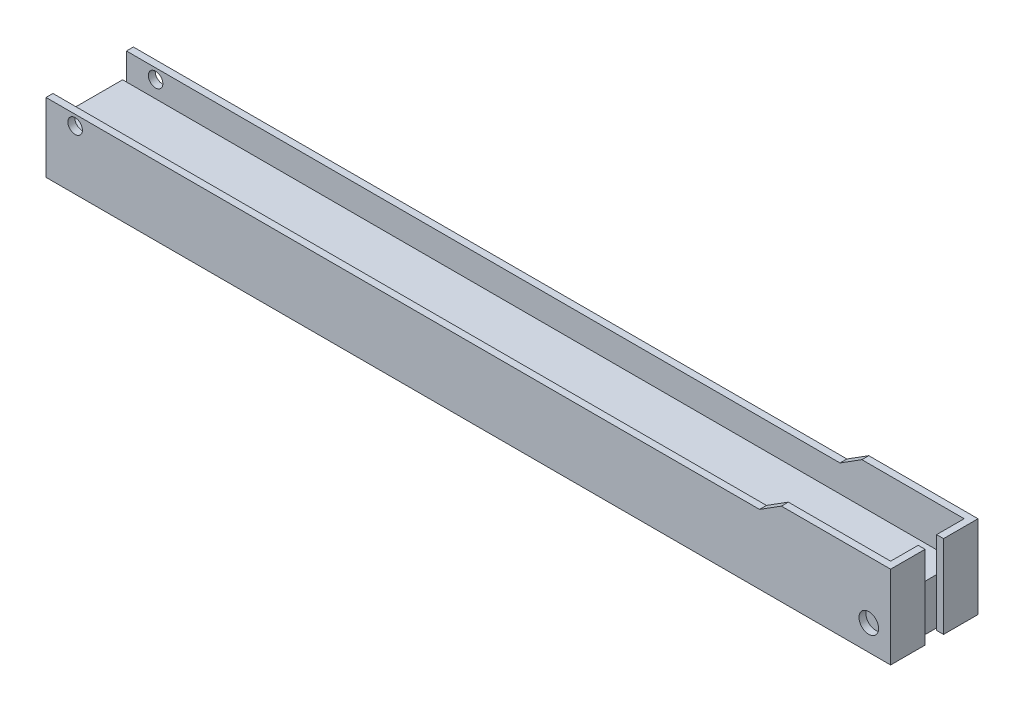
ISO-10303-21;
HEADER;
FILE_DESCRIPTION(('STEP AP214'),'2;1');
FILE_NAME('part.step','',(''),(''),'','','');
FILE_SCHEMA(('AUTOMOTIVE_DESIGN { 1 0 10303 214 1 1 1 1 }'));
ENDSEC;
DATA;
#1=APPLICATION_CONTEXT('core data for automotive mechanical design processes');
#2=APPLICATION_PROTOCOL_DEFINITION('international standard','automotive_design',2000,#1);
#3=PRODUCT_CONTEXT('',#1,'mechanical');
#4=PRODUCT('Part','Part','',(#3));
#5=PRODUCT_RELATED_PRODUCT_CATEGORY('part','',(#4));
#6=PRODUCT_DEFINITION_FORMATION('','',#4);
#7=PRODUCT_DEFINITION_CONTEXT('part definition',#1,'design');
#8=PRODUCT_DEFINITION('design','',#6,#7);
#9=PRODUCT_DEFINITION_SHAPE('','',#8);
#10=(LENGTH_UNIT() NAMED_UNIT(*) SI_UNIT(.MILLI.,.METRE.));
#11=(NAMED_UNIT(*) PLANE_ANGLE_UNIT() SI_UNIT($,.RADIAN.));
#12=(NAMED_UNIT(*) SI_UNIT($,.STERADIAN.) SOLID_ANGLE_UNIT());
#13=UNCERTAINTY_MEASURE_WITH_UNIT(LENGTH_MEASURE(1.E-05),#10,'distance_accuracy_value','');
#14=(GEOMETRIC_REPRESENTATION_CONTEXT(3) GLOBAL_UNCERTAINTY_ASSIGNED_CONTEXT((#13)) GLOBAL_UNIT_ASSIGNED_CONTEXT((#10,
#11,#12)) REPRESENTATION_CONTEXT('',''));
#15=CARTESIAN_POINT('',(0.,0.,0.));
#16=DIRECTION('',(0.,0.,1.));
#17=DIRECTION('',(1.,0.,0.));
#18=AXIS2_PLACEMENT_3D('',#15,#16,#17);
#19=CARTESIAN_POINT('',(-73.6600000000003,14.4779999999995,-7.61999999999996));
#20=DIRECTION('',(0.,0.,1.));
#21=DIRECTION('',(0.999999999999999,0.,0.));
#22=AXIS2_PLACEMENT_3D('',#19,#20,#21);
#23=PLANE('',#22);
#24=CARTESIAN_POINT('',(69.85,4.44499999999981,-7.61999999999996));
#25=DIRECTION('',(0.,0.,1.));
#26=DIRECTION('',(0.999999999999999,0.,0.));
#27=AXIS2_PLACEMENT_3D('',#24,#25,#26);
#28=CIRCLE('',#27,1.7145);
#29=CARTESIAN_POINT('',(71.5645,4.44499999999981,-7.61999999999996));
#30=VERTEX_POINT('',#29);
#31=EDGE_CURVE('E478',#30,#30,#28,.T.);
#32=ORIENTED_EDGE('',*,*,#31,.T.);
#33=EDGE_LOOP('',(#32));
#34=FACE_BOUND('',#33,.T.);
#35=CARTESIAN_POINT('',(-68.5800000000003,10.2966462483453,-7.61999999999996));
#36=DIRECTION('',(0.,0.,1.));
#37=DIRECTION('',(0.999999999999999,0.,0.));
#38=AXIS2_PLACEMENT_3D('',#35,#36,#37);
#39=CIRCLE('',#38,1.26999999999999);
#40=CARTESIAN_POINT('',(-67.3100000000003,10.2966462483453,-7.61999999999996));
#41=VERTEX_POINT('',#40);
#42=EDGE_CURVE('E458',#41,#41,#39,.T.);
#43=ORIENTED_EDGE('',*,*,#42,.T.);
#44=EDGE_LOOP('',(#43));
#45=FACE_BOUND('',#44,.T.);
#46=DIRECTION('',(0.,-0.999999999999999,0.));
#47=VECTOR('',#46,1.);
#48=CARTESIAN_POINT('',(-73.6600000000003,14.4779999999995,-7.61999999999996));
#49=LINE('',#48,#47);
#50=CARTESIAN_POINT('',(-73.6600000000002,12.0746462483452,-7.61999999999996));
#51=VERTEX_POINT('',#50);
#52=CARTESIAN_POINT('',(-73.6600000000005,0.,-7.61999999999996));
#53=VERTEX_POINT('',#52);
#54=EDGE_CURVE('E64',#51,#53,#49,.T.);
#55=ORIENTED_EDGE('',*,*,#54,.F.);
#56=DIRECTION('',(-0.999999999999999,0.,0.));
#57=VECTOR('',#56,1.);
#58=CARTESIAN_POINT('',(0.,12.0746462483456,-7.61999999999996));
#59=LINE('',#58,#57);
#60=CARTESIAN_POINT('',(50.7999999999995,12.0746462483453,-7.61999999999996));
#61=VERTEX_POINT('',#60);
#62=EDGE_CURVE('E230',#61,#51,#59,.T.);
#63=ORIENTED_EDGE('',*,*,#62,.F.);
#64=DIRECTION('',(-0.845785644482006,-0.533522861354747,0.));
#65=VECTOR('',#64,1.);
#66=CARTESIAN_POINT('',(9.01141394936245,-14.2856569173105,-7.61999999999996));
#67=LINE('',#66,#65);
#68=CARTESIAN_POINT('',(54.6099999999992,14.4779999999999,-7.61999999999996));
#69=VERTEX_POINT('',#68);
#70=EDGE_CURVE('E235',#69,#61,#67,.T.);
#71=ORIENTED_EDGE('',*,*,#70,.F.);
#72=DIRECTION('',(-0.999999999999999,0.,0.));
#73=VECTOR('',#72,1.);
#74=CARTESIAN_POINT('',(-73.6600000000003,14.4779999999995,-7.61999999999996));
#75=LINE('',#74,#73);
#76=CARTESIAN_POINT('',(73.6599999999996,14.4780000000001,-7.61999999999996));
#77=VERTEX_POINT('',#76);
#78=EDGE_CURVE('E289',#77,#69,#75,.T.);
#79=ORIENTED_EDGE('',*,*,#78,.F.);
#80=DIRECTION('',(0.,-0.999999999999999,0.));
#81=VECTOR('',#80,1.);
#82=CARTESIAN_POINT('',(73.6599999999996,14.4780000000001,-7.61999999999996));
#83=LINE('',#82,#81);
#84=CARTESIAN_POINT('',(73.6599999999998,0.,-7.61999999999996));
#85=VERTEX_POINT('',#84);
#86=EDGE_CURVE('E13',#77,#85,#83,.T.);
#87=ORIENTED_EDGE('',*,*,#86,.T.);
#88=DIRECTION('',(-0.999999999999999,0.,0.));
#89=VECTOR('',#88,1.);
#90=CARTESIAN_POINT('',(-73.6600000000005,0.,-7.61999999999996));
#91=LINE('',#90,#89);
#92=EDGE_CURVE('E299',#85,#53,#91,.T.);
#93=ORIENTED_EDGE('',*,*,#92,.T.);
#94=EDGE_LOOP('',(#55,#63,#71,#79,#87,#93));
#95=FACE_BOUND('',#94,.T.);
#96=ADVANCED_FACE('F55',(#34,#45,#95),#23,.F.);
#97=CARTESIAN_POINT('',(72.4534999999999,2.22044604925031E-13,-6.41350000000007));
#98=DIRECTION('',(0.,0.,1.));
#99=DIRECTION('',(0.999999999999999,0.,0.));
#100=AXIS2_PLACEMENT_3D('',#97,#98,#99);
#101=PLANE('',#100);
#102=CARTESIAN_POINT('',(-68.5800000000003,10.2966462483453,-6.41350000000007));
#103=DIRECTION('',(0.,0.,1.));
#104=DIRECTION('',(0.999999999999999,0.,0.));
#105=AXIS2_PLACEMENT_3D('',#102,#103,#104);
#106=CIRCLE('',#105,1.26999999999999);
#107=CARTESIAN_POINT('',(-67.3100000000003,10.2966462483453,-6.41350000000007));
#108=VERTEX_POINT('',#107);
#109=EDGE_CURVE('E59',#108,#108,#106,.T.);
#110=ORIENTED_EDGE('',*,*,#109,.F.);
#111=EDGE_LOOP('',(#110));
#112=FACE_BOUND('',#111,.T.);
#113=CARTESIAN_POINT('',(69.85,4.44499999999981,-6.41350000000007));
#114=DIRECTION('',(0.,0.,1.));
#115=DIRECTION('',(0.999999999999999,0.,0.));
#116=AXIS2_PLACEMENT_3D('',#113,#114,#115);
#117=CIRCLE('',#116,1.7145);
#118=CARTESIAN_POINT('',(71.5645,4.44499999999981,-6.41350000000007));
#119=VERTEX_POINT('',#118);
#120=EDGE_CURVE('E476',#119,#119,#117,.T.);
#121=ORIENTED_EDGE('',*,*,#120,.F.);
#122=EDGE_LOOP('',(#121));
#123=FACE_BOUND('',#122,.T.);
#124=DIRECTION('',(-0.999999999999999,0.,0.));
#125=VECTOR('',#124,1.);
#126=CARTESIAN_POINT('',(0.,12.0746462483456,-6.41350000000007));
#127=LINE('',#126,#125);
#128=CARTESIAN_POINT('',(50.7999999999995,12.0746462483452,-6.41350000000007));
#129=VERTEX_POINT('',#128);
#130=CARTESIAN_POINT('',(-73.6600000000002,12.0746462483452,-6.41350000000007));
#131=VERTEX_POINT('',#130);
#132=EDGE_CURVE('E71',#129,#131,#127,.T.);
#133=ORIENTED_EDGE('',*,*,#132,.T.);
#134=DIRECTION('',(0.,0.999999999999999,0.));
#135=VECTOR('',#134,1.);
#136=CARTESIAN_POINT('',(-73.6600000000005,0.,-6.41350000000007));
#137=LINE('',#136,#135);
#138=CARTESIAN_POINT('',(-73.6600000000003,1.20650000000022,-6.41350000000007));
#139=VERTEX_POINT('',#138);
#140=EDGE_CURVE('E242',#139,#131,#137,.T.);
#141=ORIENTED_EDGE('',*,*,#140,.F.);
#142=DIRECTION('',(-0.999999999999999,0.,0.));
#143=VECTOR('',#142,1.);
#144=CARTESIAN_POINT('',(72.4534999999999,1.20650000000022,-6.41350000000007));
#145=LINE('',#144,#143);
#146=CARTESIAN_POINT('',(72.0724999999995,1.2065,-6.41350000000007));
#147=VERTEX_POINT('',#146);
#148=EDGE_CURVE('E262',#147,#139,#145,.T.);
#149=ORIENTED_EDGE('',*,*,#148,.F.);
#150=DIRECTION('',(0.,0.999999999999999,0.));
#151=VECTOR('',#150,1.);
#152=CARTESIAN_POINT('',(72.0725,-0.000999999999917733,-6.41350000000007));
#153=LINE('',#152,#151);
#154=CARTESIAN_POINT('',(72.0724999999995,-1.11022302462516E-13,-6.41350000000007));
#155=VERTEX_POINT('',#154);
#156=EDGE_CURVE('E425',#155,#147,#153,.T.);
#157=ORIENTED_EDGE('',*,*,#156,.F.);
#158=DIRECTION('',(0.999999999999999,0.,0.));
#159=VECTOR('',#158,1.);
#160=CARTESIAN_POINT('',(72.0724999999995,-1.11022302462516E-13,-6.41350000000007));
#161=LINE('',#160,#159);
#162=CARTESIAN_POINT('',(72.4534999999999,2.22044604925031E-13,-6.41350000000007));
#163=VERTEX_POINT('',#162);
#164=EDGE_CURVE('E415',#155,#163,#161,.T.);
#165=ORIENTED_EDGE('',*,*,#164,.T.);
#166=DIRECTION('',(0.,0.999999999999999,0.));
#167=VECTOR('',#166,1.);
#168=CARTESIAN_POINT('',(72.4534999999999,2.22044604925031E-13,-6.41350000000007));
#169=LINE('',#168,#167);
#170=CARTESIAN_POINT('',(72.4534999999999,14.4779999999995,-6.41350000000007));
#171=VERTEX_POINT('',#170);
#172=EDGE_CURVE('E285',#163,#171,#169,.T.);
#173=ORIENTED_EDGE('',*,*,#172,.T.);
#174=DIRECTION('',(-0.999999999999999,0.,0.));
#175=VECTOR('',#174,1.);
#176=CARTESIAN_POINT('',(72.4534999999999,14.4779999999995,-6.41350000000007));
#177=LINE('',#176,#175);
#178=CARTESIAN_POINT('',(54.6099999999992,14.4779999999999,-6.41350000000007));
#179=VERTEX_POINT('',#178);
#180=EDGE_CURVE('E264',#171,#179,#177,.T.);
#181=ORIENTED_EDGE('',*,*,#180,.T.);
#182=DIRECTION('',(-0.845785644482006,-0.533522861354747,0.));
#183=VECTOR('',#182,1.);
#184=CARTESIAN_POINT('',(9.01141394936245,-14.2856569173105,-6.41350000000007));
#185=LINE('',#184,#183);
#186=EDGE_CURVE('E245',#179,#129,#185,.T.);
#187=ORIENTED_EDGE('',*,*,#186,.T.);
#188=EDGE_LOOP('',(#133,#141,#149,#157,#165,#173,#181,#187));
#189=FACE_BOUND('',#188,.T.);
#190=ADVANCED_FACE('F240',(#112,#123,#189),#101,.T.);
#191=CARTESIAN_POINT('',(-4.44089209850063E-13,14.4779999999999,0.));
#192=DIRECTION('',(0.,0.999999999999999,0.));
#193=DIRECTION('',(0.,0.,1.));
#194=AXIS2_PLACEMENT_3D('',#191,#192,#193);
#195=PLANE('',#194);
#196=DIRECTION('',(0.,0.,-1.));
#197=VECTOR('',#196,1.);
#198=CARTESIAN_POINT('',(73.6599999999996,14.4780000000001,-7.61999999999996));
#199=LINE('',#198,#197);
#200=CARTESIAN_POINT('',(73.6599999999996,14.4780000000001,7.61999999999996));
#201=VERTEX_POINT('',#200);
#202=CARTESIAN_POINT('',(73.6599999999996,14.4780000000001,1.61290000000003));
#203=VERTEX_POINT('',#202);
#204=EDGE_CURVE('E286',#201,#203,#199,.T.);
#205=ORIENTED_EDGE('',*,*,#204,.T.);
#206=DIRECTION('',(0.999999999999999,0.,0.));
#207=VECTOR('',#206,1.);
#208=CARTESIAN_POINT('',(-73.6610000000004,14.478,1.61290000000003));
#209=LINE('',#208,#207);
#210=CARTESIAN_POINT('',(72.4534999999999,14.4779999999995,1.61290000000003));
#211=VERTEX_POINT('',#210);
#212=EDGE_CURVE('E338',#211,#203,#209,.T.);
#213=ORIENTED_EDGE('',*,*,#212,.F.);
#214=DIRECTION('',(0.,0.,-1.));
#215=VECTOR('',#214,1.);
#216=CARTESIAN_POINT('',(72.4534999999999,14.4779999999995,0.));
#217=LINE('',#216,#215);
#218=CARTESIAN_POINT('',(72.4534999999999,14.4779999999995,6.41350000000007));
#219=VERTEX_POINT('',#218);
#220=EDGE_CURVE('E370',#219,#211,#217,.T.);
#221=ORIENTED_EDGE('',*,*,#220,.F.);
#222=DIRECTION('',(-0.999999999999999,0.,0.));
#223=VECTOR('',#222,1.);
#224=CARTESIAN_POINT('',(72.4534999999999,14.4779999999995,6.41350000000007));
#225=LINE('',#224,#223);
#226=CARTESIAN_POINT('',(54.6099999999992,14.4779999999999,6.41350000000007));
#227=VERTEX_POINT('',#226);
#228=EDGE_CURVE('E266',#219,#227,#225,.T.);
#229=ORIENTED_EDGE('',*,*,#228,.T.);
#230=DIRECTION('',(0.,0.,1.));
#231=VECTOR('',#230,1.);
#232=CARTESIAN_POINT('',(54.6099999999992,14.4779999999999,-7.6210000000001));
#233=LINE('',#232,#231);
#234=CARTESIAN_POINT('',(54.6099999999992,14.4779999999999,7.61999999999996));
#235=VERTEX_POINT('',#234);
#236=EDGE_CURVE('E341',#227,#235,#233,.T.);
#237=ORIENTED_EDGE('',*,*,#236,.T.);
#238=DIRECTION('',(0.999999999999999,0.,0.));
#239=VECTOR('',#238,1.);
#240=CARTESIAN_POINT('',(-73.6600000000003,14.4779999999995,7.61999999999996));
#241=LINE('',#240,#239);
#242=EDGE_CURVE('E293',#235,#201,#241,.T.);
#243=ORIENTED_EDGE('',*,*,#242,.T.);
#244=EDGE_LOOP('',(#205,#213,#221,#229,#237,#243));
#245=FACE_BOUND('',#244,.T.);
#246=ADVANCED_FACE('F336',(#245),#195,.T.);
#247=CARTESIAN_POINT('',(73.6599999999996,14.4780000000001,-7.61999999999996));
#248=DIRECTION('',(-0.999999999999999,0.,0.));
#249=DIRECTION('',(0.,0.,1.));
#250=AXIS2_PLACEMENT_3D('',#247,#248,#249);
#251=PLANE('',#250);
#252=DIRECTION('',(0.,0.999999999999999,0.));
#253=VECTOR('',#252,1.);
#254=CARTESIAN_POINT('',(73.6599999999998,0.,1.61290000000003));
#255=LINE('',#254,#253);
#256=CARTESIAN_POINT('',(73.6599999999998,0.,1.61290000000003));
#257=VERTEX_POINT('',#256);
#258=EDGE_CURVE('E333',#257,#203,#255,.T.);
#259=ORIENTED_EDGE('',*,*,#258,.T.);
#260=ORIENTED_EDGE('',*,*,#204,.F.);
#261=DIRECTION('',(0.,-0.999999999999999,0.));
#262=VECTOR('',#261,1.);
#263=CARTESIAN_POINT('',(73.6599999999996,14.4780000000001,7.61999999999996));
#264=LINE('',#263,#262);
#265=CARTESIAN_POINT('',(73.6599999999998,0.,7.61999999999996));
#266=VERTEX_POINT('',#265);
#267=EDGE_CURVE('E295',#201,#266,#264,.T.);
#268=ORIENTED_EDGE('',*,*,#267,.T.);
#269=DIRECTION('',(0.,0.,-1.));
#270=VECTOR('',#269,1.);
#271=CARTESIAN_POINT('',(73.6599999999998,0.,-7.61999999999996));
#272=LINE('',#271,#270);
#273=EDGE_CURVE('E296',#266,#257,#272,.T.);
#274=ORIENTED_EDGE('',*,*,#273,.T.);
#275=EDGE_LOOP('',(#259,#260,#268,#274));
#276=FACE_BOUND('',#275,.T.);
#277=ADVANCED_FACE('F332',(#276),#251,.F.);
#278=CARTESIAN_POINT('',(72.4534999999999,2.22044604925031E-13,0.));
#279=DIRECTION('',(-0.999999999999999,0.,0.));
#280=DIRECTION('',(0.,0.,1.));
#281=AXIS2_PLACEMENT_3D('',#278,#279,#280);
#282=PLANE('',#281);
#283=ORIENTED_EDGE('',*,*,#220,.T.);
#284=DIRECTION('',(0.,0.999999999999999,0.));
#285=VECTOR('',#284,1.);
#286=CARTESIAN_POINT('',(72.4534999999999,2.22044604925031E-13,1.61290000000003));
#287=LINE('',#286,#285);
#288=CARTESIAN_POINT('',(72.4534999999999,2.22044604925031E-13,1.61290000000003));
#289=VERTEX_POINT('',#288);
#290=EDGE_CURVE('E413',#289,#211,#287,.T.);
#291=ORIENTED_EDGE('',*,*,#290,.F.);
#292=DIRECTION('',(0.,0.,1.));
#293=VECTOR('',#292,1.);
#294=CARTESIAN_POINT('',(72.4534999999999,2.22044604925031E-13,5.94708760241214));
#295=LINE('',#294,#293);
#296=CARTESIAN_POINT('',(72.4534999999999,2.22044604925031E-13,6.41350000000007));
#297=VERTEX_POINT('',#296);
#298=EDGE_CURVE('E435',#289,#297,#295,.T.);
#299=ORIENTED_EDGE('',*,*,#298,.T.);
#300=DIRECTION('',(0.,-0.999999999999999,0.));
#301=VECTOR('',#300,1.);
#302=CARTESIAN_POINT('',(72.4534999999999,2.22044604925031E-13,6.41350000000007));
#303=LINE('',#302,#301);
#304=EDGE_CURVE('E253',#219,#297,#303,.T.);
#305=ORIENTED_EDGE('',*,*,#304,.F.);
#306=EDGE_LOOP('',(#283,#291,#299,#305));
#307=FACE_BOUND('',#306,.T.);
#308=ADVANCED_FACE('F498',(#307),#282,.T.);
#309=CARTESIAN_POINT('',(-73.6600000000003,14.4779999999995,-7.61999999999996));
#310=DIRECTION('',(0.999999999999999,0.,0.));
#311=DIRECTION('',(0.,0.,-1.));
#312=AXIS2_PLACEMENT_3D('',#309,#310,#311);
#313=PLANE('',#312);
#314=ORIENTED_EDGE('',*,*,#140,.T.);
#315=DIRECTION('',(0.,0.,-1.));
#316=VECTOR('',#315,1.);
#317=CARTESIAN_POINT('',(-73.6600000000002,12.0746462483452,7.6210000000001));
#318=LINE('',#317,#316);
#319=EDGE_CURVE('E227',#131,#51,#318,.T.);
#320=ORIENTED_EDGE('',*,*,#319,.T.);
#321=ORIENTED_EDGE('',*,*,#54,.T.);
#322=DIRECTION('',(0.,0.,1.));
#323=VECTOR('',#322,1.);
#324=CARTESIAN_POINT('',(-73.6600000000005,0.,-7.61999999999996));
#325=LINE('',#324,#323);
#326=CARTESIAN_POINT('',(-73.6600000000005,0.,7.61999999999996));
#327=VERTEX_POINT('',#326);
#328=EDGE_CURVE('E302',#53,#327,#325,.T.);
#329=ORIENTED_EDGE('',*,*,#328,.T.);
#330=DIRECTION('',(0.,-0.999999999999999,0.));
#331=VECTOR('',#330,1.);
#332=CARTESIAN_POINT('',(-73.6600000000003,14.4779999999995,7.61999999999996));
#333=LINE('',#332,#331);
#334=CARTESIAN_POINT('',(-73.6600000000002,12.0746462483452,7.61999999999996));
#335=VERTEX_POINT('',#334);
#336=EDGE_CURVE('E309',#335,#327,#333,.T.);
#337=ORIENTED_EDGE('',*,*,#336,.F.);
#338=DIRECTION('',(0.,0.,1.));
#339=VECTOR('',#338,1.);
#340=CARTESIAN_POINT('',(-73.6600000000002,12.0746462483452,-7.6210000000001));
#341=LINE('',#340,#339);
#342=CARTESIAN_POINT('',(-73.6600000000002,12.0746462483452,6.41350000000007));
#343=VERTEX_POINT('',#342);
#344=EDGE_CURVE('E346',#343,#335,#341,.T.);
#345=ORIENTED_EDGE('',*,*,#344,.F.);
#346=DIRECTION('',(0.,-0.999999999999999,0.));
#347=VECTOR('',#346,1.);
#348=CARTESIAN_POINT('',(-73.6600000000005,0.,6.41350000000007));
#349=LINE('',#348,#347);
#350=CARTESIAN_POINT('',(-73.6600000000003,1.20650000000022,6.41350000000007));
#351=VERTEX_POINT('',#350);
#352=EDGE_CURVE('E251',#343,#351,#349,.T.);
#353=ORIENTED_EDGE('',*,*,#352,.T.);
#354=DIRECTION('',(0.,0.,1.));
#355=VECTOR('',#354,1.);
#356=CARTESIAN_POINT('',(-73.6600000000003,1.20650000000022,0.));
#357=LINE('',#356,#355);
#358=CARTESIAN_POINT('',(-73.6600000000003,1.20650000000022,4.67708760241203));
#359=VERTEX_POINT('',#358);
#360=EDGE_CURVE('E255',#359,#351,#357,.T.);
#361=ORIENTED_EDGE('',*,*,#360,.F.);
#362=DIRECTION('',(0.,0.999999999999999,0.));
#363=VECTOR('',#362,1.);
#364=CARTESIAN_POINT('',(-73.6600000000005,0.,4.67708760241203));
#365=LINE('',#364,#363);
#366=CARTESIAN_POINT('',(-73.6599999999998,1.71450000000017,4.67708760241203));
#367=VERTEX_POINT('',#366);
#368=EDGE_CURVE('E390',#359,#367,#365,.T.);
#369=ORIENTED_EDGE('',*,*,#368,.T.);
#370=DIRECTION('',(0.,0.,1.));
#371=VECTOR('',#370,1.);
#372=CARTESIAN_POINT('',(-73.6599999999998,1.71450000000017,0.));
#373=LINE('',#372,#371);
#374=CARTESIAN_POINT('',(-73.6599999999998,1.71450000000017,5.94708760241214));
#375=VERTEX_POINT('',#374);
#376=EDGE_CURVE('E387',#367,#375,#373,.T.);
#377=ORIENTED_EDGE('',*,*,#376,.T.);
#378=DIRECTION('',(0.,0.999999999999999,0.));
#379=VECTOR('',#378,1.);
#380=CARTESIAN_POINT('',(-73.6600000000005,0.,5.94708760241214));
#381=LINE('',#380,#379);
#382=CARTESIAN_POINT('',(-73.6600000000003,8.06450000000014,5.94708760241214));
#383=VERTEX_POINT('',#382);
#384=EDGE_CURVE('E384',#375,#383,#381,.T.);
#385=ORIENTED_EDGE('',*,*,#384,.T.);
#386=DIRECTION('',(0.,0.,-1.));
#387=VECTOR('',#386,1.);
#388=CARTESIAN_POINT('',(-73.6600000000003,8.06450000000014,0.));
#389=LINE('',#388,#387);
#390=CARTESIAN_POINT('',(-73.6600000000003,8.06450000000014,-5.73691239758789));
#391=VERTEX_POINT('',#390);
#392=EDGE_CURVE('E381',#383,#391,#389,.T.);
#393=ORIENTED_EDGE('',*,*,#392,.T.);
#394=DIRECTION('',(0.,-0.999999999999999,0.));
#395=VECTOR('',#394,1.);
#396=CARTESIAN_POINT('',(-73.6600000000005,0.,-5.73691239758789));
#397=LINE('',#396,#395);
#398=CARTESIAN_POINT('',(-73.6599999999998,1.71450000000017,-5.73691239758789));
#399=VERTEX_POINT('',#398);
#400=EDGE_CURVE('E378',#391,#399,#397,.T.);
#401=ORIENTED_EDGE('',*,*,#400,.T.);
#402=DIRECTION('',(0.,0.,1.));
#403=VECTOR('',#402,1.);
#404=CARTESIAN_POINT('',(-73.6599999999998,1.71450000000017,0.));
#405=LINE('',#404,#403);
#406=CARTESIAN_POINT('',(-73.6599999999998,1.71450000000017,-4.46691239758801));
#407=VERTEX_POINT('',#406);
#408=EDGE_CURVE('E375',#399,#407,#405,.T.);
#409=ORIENTED_EDGE('',*,*,#408,.T.);
#410=DIRECTION('',(0.,-0.999999999999999,0.));
#411=VECTOR('',#410,1.);
#412=CARTESIAN_POINT('',(-73.6600000000005,0.,-4.46691239758801));
#413=LINE('',#412,#411);
#414=CARTESIAN_POINT('',(-73.6600000000003,1.20650000000022,-4.46691239758801));
#415=VERTEX_POINT('',#414);
#416=EDGE_CURVE('E357',#407,#415,#413,.T.);
#417=ORIENTED_EDGE('',*,*,#416,.T.);
#418=EDGE_CURVE('E250',#139,#415,#357,.T.);
#419=ORIENTED_EDGE('',*,*,#418,.F.);
#420=EDGE_LOOP('',(#314,#320,#321,#329,#337,#345,#353,#361,#369,#377,#385,#393,#401,#409,#417,#419));
#421=FACE_BOUND('',#420,.T.);
#422=ADVANCED_FACE('F247',(#421),#313,.F.);
#423=DIRECTION('',(0.,0.,-1.));
#424=VECTOR('',#423,1.);
#425=CARTESIAN_POINT('',(54.6099999999992,14.4779999999999,7.6210000000001));
#426=LINE('',#425,#424);
#427=EDGE_CURVE('E234',#179,#69,#426,.T.);
#428=ORIENTED_EDGE('',*,*,#427,.F.);
#429=ORIENTED_EDGE('',*,*,#180,.F.);
#430=CARTESIAN_POINT('',(72.4534999999999,14.4779999999995,-1.61290000000003));
#431=VERTEX_POINT('',#430);
#432=EDGE_CURVE('E369',#431,#171,#217,.T.);
#433=ORIENTED_EDGE('',*,*,#432,.F.);
#434=DIRECTION('',(0.999999999999999,0.,0.));
#435=VECTOR('',#434,1.);
#436=CARTESIAN_POINT('',(-73.6610000000004,14.478,-1.61290000000003));
#437=LINE('',#436,#435);
#438=CARTESIAN_POINT('',(73.6599999999996,14.4780000000001,-1.61290000000003));
#439=VERTEX_POINT('',#438);
#440=EDGE_CURVE('E79',#431,#439,#437,.T.);
#441=ORIENTED_EDGE('',*,*,#440,.T.);
#442=EDGE_CURVE('E290',#439,#77,#199,.T.);
#443=ORIENTED_EDGE('',*,*,#442,.T.);
#444=ORIENTED_EDGE('',*,*,#78,.T.);
#445=EDGE_LOOP('',(#428,#429,#433,#441,#443,#444));
#446=FACE_BOUND('',#445,.T.);
#447=ADVANCED_FACE('F524',(#446),#195,.T.);
#448=CARTESIAN_POINT('',(-73.6600000000003,14.4779999999995,7.61999999999996));
#449=DIRECTION('',(0.,0.,-1.));
#450=DIRECTION('',(-0.999999999999999,0.,0.));
#451=AXIS2_PLACEMENT_3D('',#448,#449,#450);
#452=PLANE('',#451);
#453=CARTESIAN_POINT('',(-68.5800000000003,10.2966462483453,7.61999999999996));
#454=DIRECTION('',(0.,0.,1.));
#455=DIRECTION('',(0.999999999999999,0.,0.));
#456=AXIS2_PLACEMENT_3D('',#453,#454,#455);
#457=CIRCLE('',#456,1.26999999999999);
#458=CARTESIAN_POINT('',(-67.3100000000003,10.2966462483453,7.61999999999996));
#459=VERTEX_POINT('',#458);
#460=EDGE_CURVE('E457',#459,#459,#457,.T.);
#461=ORIENTED_EDGE('',*,*,#460,.F.);
#462=EDGE_LOOP('',(#461));
#463=FACE_BOUND('',#462,.T.);
#464=CARTESIAN_POINT('',(69.85,4.44499999999981,7.61999999999996));
#465=DIRECTION('',(0.,0.,1.));
#466=DIRECTION('',(0.999999999999999,0.,0.));
#467=AXIS2_PLACEMENT_3D('',#464,#465,#466);
#468=CIRCLE('',#467,1.7145);
#469=CARTESIAN_POINT('',(71.5645,4.44499999999981,7.61999999999996));
#470=VERTEX_POINT('',#469);
#471=EDGE_CURVE('E360',#470,#470,#468,.T.);
#472=ORIENTED_EDGE('',*,*,#471,.F.);
#473=EDGE_LOOP('',(#472));
#474=FACE_BOUND('',#473,.T.);
#475=DIRECTION('',(-0.845785644482006,-0.533522861354747,0.));
#476=VECTOR('',#475,1.);
#477=CARTESIAN_POINT('',(9.01141394936245,-14.2856569173105,7.61999999999996));
#478=LINE('',#477,#476);
#479=CARTESIAN_POINT('',(50.7999999999995,12.0746462483453,7.61999999999996));
#480=VERTEX_POINT('',#479);
#481=EDGE_CURVE('E342',#235,#480,#478,.T.);
#482=ORIENTED_EDGE('',*,*,#481,.T.);
#483=DIRECTION('',(-0.999999999999999,0.,0.));
#484=VECTOR('',#483,1.);
#485=CARTESIAN_POINT('',(0.,12.0746462483456,7.61999999999996));
#486=LINE('',#485,#484);
#487=EDGE_CURVE('E344',#480,#335,#486,.T.);
#488=ORIENTED_EDGE('',*,*,#487,.T.);
#489=ORIENTED_EDGE('',*,*,#336,.T.);
#490=DIRECTION('',(0.999999999999999,0.,0.));
#491=VECTOR('',#490,1.);
#492=CARTESIAN_POINT('',(-73.6600000000005,0.,7.61999999999996));
#493=LINE('',#492,#491);
#494=EDGE_CURVE('E305',#327,#266,#493,.T.);
#495=ORIENTED_EDGE('',*,*,#494,.T.);
#496=ORIENTED_EDGE('',*,*,#267,.F.);
#497=ORIENTED_EDGE('',*,*,#242,.F.);
#498=EDGE_LOOP('',(#482,#488,#489,#495,#496,#497));
#499=FACE_BOUND('',#498,.T.);
#500=ADVANCED_FACE('F326',(#463,#474,#499),#452,.F.);
#501=CARTESIAN_POINT('',(72.4534999999999,2.22044604925031E-13,6.41350000000007));
#502=DIRECTION('',(0.,0.,-1.));
#503=DIRECTION('',(0.,0.999999999999999,0.));
#504=AXIS2_PLACEMENT_3D('',#501,#502,#503);
#505=PLANE('',#504);
#506=CARTESIAN_POINT('',(-68.5800000000003,10.2966462483453,6.41350000000007));
#507=DIRECTION('',(0.,0.,-1.));
#508=DIRECTION('',(0.,0.999999999999999,0.));
#509=AXIS2_PLACEMENT_3D('',#506,#507,#508);
#510=CIRCLE('',#509,1.26999999999999);
#511=CARTESIAN_POINT('',(-68.5800000000003,11.5666462483452,6.41350000000007));
#512=VERTEX_POINT('',#511);
#513=EDGE_CURVE('E366',#512,#512,#510,.T.);
#514=ORIENTED_EDGE('',*,*,#513,.F.);
#515=EDGE_LOOP('',(#514));
#516=FACE_BOUND('',#515,.T.);
#517=CARTESIAN_POINT('',(69.85,4.44499999999981,6.41350000000007));
#518=DIRECTION('',(0.,0.,-1.));
#519=DIRECTION('',(0.,0.999999999999999,0.));
#520=AXIS2_PLACEMENT_3D('',#517,#518,#519);
#521=CIRCLE('',#520,1.7145);
#522=CARTESIAN_POINT('',(69.85,6.15949999999981,6.41350000000007));
#523=VERTEX_POINT('',#522);
#524=EDGE_CURVE('E363',#523,#523,#521,.F.);
#525=ORIENTED_EDGE('',*,*,#524,.T.);
#526=EDGE_LOOP('',(#525));
#527=FACE_BOUND('',#526,.T.);
#528=DIRECTION('',(-0.999999999999999,0.,0.));
#529=VECTOR('',#528,1.);
#530=CARTESIAN_POINT('',(0.,12.0746462483456,6.41350000000007));
#531=LINE('',#530,#529);
#532=CARTESIAN_POINT('',(50.7999999999995,12.0746462483453,6.41350000000007));
#533=VERTEX_POINT('',#532);
#534=EDGE_CURVE('E350',#533,#343,#531,.T.);
#535=ORIENTED_EDGE('',*,*,#534,.F.);
#536=DIRECTION('',(-0.845785644482006,-0.533522861354747,0.));
#537=VECTOR('',#536,1.);
#538=CARTESIAN_POINT('',(9.01141394936245,-14.2856569173105,6.41350000000007));
#539=LINE('',#538,#537);
#540=EDGE_CURVE('E354',#227,#533,#539,.T.);
#541=ORIENTED_EDGE('',*,*,#540,.F.);
#542=ORIENTED_EDGE('',*,*,#228,.F.);
#543=ORIENTED_EDGE('',*,*,#304,.T.);
#544=DIRECTION('',(-0.999999999999999,0.,0.));
#545=VECTOR('',#544,1.);
#546=CARTESIAN_POINT('',(72.0724999999995,-1.11022302462516E-13,6.41350000000007));
#547=LINE('',#546,#545);
#548=CARTESIAN_POINT('',(72.0724999999995,-1.11022302462516E-13,6.41350000000007));
#549=VERTEX_POINT('',#548);
#550=EDGE_CURVE('E411',#297,#549,#547,.T.);
#551=ORIENTED_EDGE('',*,*,#550,.T.);
#552=DIRECTION('',(0.,0.999999999999999,0.));
#553=VECTOR('',#552,1.);
#554=CARTESIAN_POINT('',(72.0725,-0.000999999999917733,6.41350000000007));
#555=LINE('',#554,#553);
#556=CARTESIAN_POINT('',(72.0724999999995,1.2065,6.41350000000007));
#557=VERTEX_POINT('',#556);
#558=EDGE_CURVE('E409',#549,#557,#555,.T.);
#559=ORIENTED_EDGE('',*,*,#558,.T.);
#560=DIRECTION('',(-0.999999999999999,0.,0.));
#561=VECTOR('',#560,1.);
#562=CARTESIAN_POINT('',(72.4534999999999,1.20650000000022,6.41350000000007));
#563=LINE('',#562,#561);
#564=EDGE_CURVE('E269',#557,#351,#563,.T.);
#565=ORIENTED_EDGE('',*,*,#564,.T.);
#566=ORIENTED_EDGE('',*,*,#352,.F.);
#567=EDGE_LOOP('',(#535,#541,#542,#543,#551,#559,#565,#566));
#568=FACE_BOUND('',#567,.T.);
#569=ADVANCED_FACE('F404',(#516,#527,#568),#505,.T.);
#570=ORIENTED_EDGE('',*,*,#442,.F.);
#571=DIRECTION('',(0.,0.999999999999999,0.));
#572=VECTOR('',#571,1.);
#573=CARTESIAN_POINT('',(73.6599999999998,0.,-1.61290000000003));
#574=LINE('',#573,#572);
#575=CARTESIAN_POINT('',(73.6599999999998,0.,-1.61290000000003));
#576=VERTEX_POINT('',#575);
#577=EDGE_CURVE('E417',#576,#439,#574,.T.);
#578=ORIENTED_EDGE('',*,*,#577,.F.);
#579=EDGE_CURVE('E261',#576,#85,#272,.T.);
#580=ORIENTED_EDGE('',*,*,#579,.T.);
#581=ORIENTED_EDGE('',*,*,#86,.F.);
#582=EDGE_LOOP('',(#570,#578,#580,#581));
#583=FACE_BOUND('',#582,.T.);
#584=ADVANCED_FACE('F57',(#583),#251,.F.);
#585=CARTESIAN_POINT('',(0.,0.,0.));
#586=DIRECTION('',(0.,0.999999999999999,0.));
#587=DIRECTION('',(0.,0.,1.));
#588=AXIS2_PLACEMENT_3D('',#585,#586,#587);
#589=PLANE('',#588);
#590=ORIENTED_EDGE('',*,*,#579,.F.);
#591=DIRECTION('',(0.999999999999999,0.,0.));
#592=VECTOR('',#591,1.);
#593=CARTESIAN_POINT('',(-73.661,1.11022302462516E-13,-1.61290000000003));
#594=LINE('',#593,#592);
#595=CARTESIAN_POINT('',(72.4534999999999,2.22044604925031E-13,-1.61290000000003));
#596=VERTEX_POINT('',#595);
#597=EDGE_CURVE('E488',#596,#576,#594,.T.);
#598=ORIENTED_EDGE('',*,*,#597,.F.);
#599=EDGE_CURVE('E436',#163,#596,#295,.T.);
#600=ORIENTED_EDGE('',*,*,#599,.F.);
#601=ORIENTED_EDGE('',*,*,#164,.F.);
#602=DIRECTION('',(0.,0.,-1.));
#603=VECTOR('',#602,1.);
#604=CARTESIAN_POINT('',(72.0724999999995,-1.11022302462516E-13,5.94708760241214));
#605=LINE('',#604,#603);
#606=EDGE_CURVE('E433',#549,#155,#605,.T.);
#607=ORIENTED_EDGE('',*,*,#606,.F.);
#608=ORIENTED_EDGE('',*,*,#550,.F.);
#609=ORIENTED_EDGE('',*,*,#298,.F.);
#610=DIRECTION('',(0.999999999999999,0.,0.));
#611=VECTOR('',#610,1.);
#612=CARTESIAN_POINT('',(-73.661,1.11022302462516E-13,1.61290000000003));
#613=LINE('',#612,#611);
#614=EDGE_CURVE('E420',#289,#257,#613,.T.);
#615=ORIENTED_EDGE('',*,*,#614,.T.);
#616=ORIENTED_EDGE('',*,*,#273,.F.);
#617=ORIENTED_EDGE('',*,*,#494,.F.);
#618=ORIENTED_EDGE('',*,*,#328,.F.);
#619=ORIENTED_EDGE('',*,*,#92,.F.);
#620=EDGE_LOOP('',(#590,#598,#600,#601,#607,#608,#609,#615,#616,#617,#618,#619));
#621=FACE_BOUND('',#620,.T.);
#622=ADVANCED_FACE('F320',(#621),#589,.F.);
#623=CARTESIAN_POINT('',(72.4534999999999,2.22044604925031E-13,-4.46691239758801));
#624=DIRECTION('',(0.,0.,-1.));
#625=DIRECTION('',(-0.999999999999999,0.,0.));
#626=AXIS2_PLACEMENT_3D('',#623,#624,#625);
#627=PLANE('',#626);
#628=DIRECTION('',(0.,-0.999999999999999,0.));
#629=VECTOR('',#628,1.);
#630=CARTESIAN_POINT('',(72.0725,-0.000999999999917733,-4.46691239758801));
#631=LINE('',#630,#629);
#632=CARTESIAN_POINT('',(72.0725,1.71449999999973,-4.46691239758801));
#633=VERTEX_POINT('',#632);
#634=CARTESIAN_POINT('',(72.0724999999995,1.2065,-4.46691239758801));
#635=VERTEX_POINT('',#634);
#636=EDGE_CURVE('E445',#633,#635,#631,.T.);
#637=ORIENTED_EDGE('',*,*,#636,.T.);
#638=DIRECTION('',(-0.999999999999999,0.,0.));
#639=VECTOR('',#638,1.);
#640=CARTESIAN_POINT('',(72.4534999999999,1.20650000000022,-4.46691239758801));
#641=LINE('',#640,#639);
#642=EDGE_CURVE('E259',#635,#415,#641,.T.);
#643=ORIENTED_EDGE('',*,*,#642,.T.);
#644=ORIENTED_EDGE('',*,*,#416,.F.);
#645=DIRECTION('',(-0.999999999999999,0.,0.));
#646=VECTOR('',#645,1.);
#647=CARTESIAN_POINT('',(72.4534999999999,1.71450000000006,-4.46691239758801));
#648=LINE('',#647,#646);
#649=EDGE_CURVE('E283',#633,#407,#648,.T.);
#650=ORIENTED_EDGE('',*,*,#649,.F.);
#651=EDGE_LOOP('',(#637,#643,#644,#650));
#652=FACE_BOUND('',#651,.T.);
#653=ADVANCED_FACE('F530',(#652),#627,.T.);
#654=CARTESIAN_POINT('',(72.4534999999999,1.20650000000022,0.));
#655=DIRECTION('',(0.,-0.999999999999999,0.));
#656=DIRECTION('',(0.,0.,-1.));
#657=AXIS2_PLACEMENT_3D('',#654,#655,#656);
#658=PLANE('',#657);
#659=DIRECTION('',(0.,0.,1.));
#660=VECTOR('',#659,1.);
#661=CARTESIAN_POINT('',(72.0724999999995,1.2065,5.94708760241214));
#662=LINE('',#661,#660);
#663=EDGE_CURVE('E431',#147,#635,#662,.T.);
#664=ORIENTED_EDGE('',*,*,#663,.F.);
#665=ORIENTED_EDGE('',*,*,#148,.T.);
#666=ORIENTED_EDGE('',*,*,#418,.T.);
#667=ORIENTED_EDGE('',*,*,#642,.F.);
#668=EDGE_LOOP('',(#664,#665,#666,#667));
#669=FACE_BOUND('',#668,.T.);
#670=ADVANCED_FACE('F536',(#669),#658,.F.);
#671=ORIENTED_EDGE('',*,*,#564,.F.);
#672=DIRECTION('',(0.,0.,1.));
#673=VECTOR('',#672,1.);
#674=CARTESIAN_POINT('',(72.0724999999995,1.2065,5.94708760241214));
#675=LINE('',#674,#673);
#676=CARTESIAN_POINT('',(72.0724999999995,1.2065,4.67708760241203));
#677=VERTEX_POINT('',#676);
#678=EDGE_CURVE('E455',#677,#557,#675,.T.);
#679=ORIENTED_EDGE('',*,*,#678,.F.);
#680=DIRECTION('',(-0.999999999999999,0.,0.));
#681=VECTOR('',#680,1.);
#682=CARTESIAN_POINT('',(72.4534999999999,1.20650000000022,4.67708760241203));
#683=LINE('',#682,#681);
#684=EDGE_CURVE('E271',#677,#359,#683,.T.);
#685=ORIENTED_EDGE('',*,*,#684,.T.);
#686=ORIENTED_EDGE('',*,*,#360,.T.);
#687=EDGE_LOOP('',(#671,#679,#685,#686));
#688=FACE_BOUND('',#687,.T.);
#689=ADVANCED_FACE('F396',(#688),#658,.F.);
#690=CARTESIAN_POINT('',(72.4534999999999,2.22044604925031E-13,4.67708760241203));
#691=DIRECTION('',(0.,0.,1.));
#692=DIRECTION('',(0.999999999999999,0.,0.));
#693=AXIS2_PLACEMENT_3D('',#690,#691,#692);
#694=PLANE('',#693);
#695=DIRECTION('',(0.,0.999999999999999,0.));
#696=VECTOR('',#695,1.);
#697=CARTESIAN_POINT('',(72.0725,-0.000999999999917733,4.67708760241203));
#698=LINE('',#697,#696);
#699=CARTESIAN_POINT('',(72.0725,1.71449999999973,4.67708760241203));
#700=VERTEX_POINT('',#699);
#701=EDGE_CURVE('E452',#677,#700,#698,.T.);
#702=ORIENTED_EDGE('',*,*,#701,.T.);
#703=DIRECTION('',(-0.999999999999999,0.,0.));
#704=VECTOR('',#703,1.);
#705=CARTESIAN_POINT('',(72.4534999999999,1.71450000000006,4.67708760241203));
#706=LINE('',#705,#704);
#707=EDGE_CURVE('E273',#700,#367,#706,.T.);
#708=ORIENTED_EDGE('',*,*,#707,.T.);
#709=ORIENTED_EDGE('',*,*,#368,.F.);
#710=ORIENTED_EDGE('',*,*,#684,.F.);
#711=EDGE_LOOP('',(#702,#708,#709,#710));
#712=FACE_BOUND('',#711,.T.);
#713=ADVANCED_FACE('F558',(#712),#694,.T.);
#714=CARTESIAN_POINT('',(72.4534999999999,1.71450000000006,0.));
#715=DIRECTION('',(0.,-0.999999999999999,0.));
#716=DIRECTION('',(0.,0.,-1.));
#717=AXIS2_PLACEMENT_3D('',#714,#715,#716);
#718=PLANE('',#717);
#719=DIRECTION('',(0.,0.,1.));
#720=VECTOR('',#719,1.);
#721=CARTESIAN_POINT('',(72.0725,1.71449999999973,5.94708760241214));
#722=LINE('',#721,#720);
#723=CARTESIAN_POINT('',(72.0725,1.71449999999973,5.94708760241214));
#724=VERTEX_POINT('',#723);
#725=EDGE_CURVE('E449',#700,#724,#722,.T.);
#726=ORIENTED_EDGE('',*,*,#725,.T.);
#727=DIRECTION('',(-0.999999999999999,0.,0.));
#728=VECTOR('',#727,1.);
#729=CARTESIAN_POINT('',(72.4534999999999,1.71450000000006,5.94708760241214));
#730=LINE('',#729,#728);
#731=EDGE_CURVE('E275',#724,#375,#730,.T.);
#732=ORIENTED_EDGE('',*,*,#731,.T.);
#733=ORIENTED_EDGE('',*,*,#376,.F.);
#734=ORIENTED_EDGE('',*,*,#707,.F.);
#735=EDGE_LOOP('',(#726,#732,#733,#734));
#736=FACE_BOUND('',#735,.T.);
#737=ADVANCED_FACE('F554',(#736),#718,.T.);
#738=CARTESIAN_POINT('',(72.4534999999999,2.22044604925031E-13,5.94708760241214));
#739=DIRECTION('',(0.,0.,1.));
#740=DIRECTION('',(0.999999999999999,0.,0.));
#741=AXIS2_PLACEMENT_3D('',#738,#739,#740);
#742=PLANE('',#741);
#743=DIRECTION('',(0.,0.999999999999999,0.));
#744=VECTOR('',#743,1.);
#745=CARTESIAN_POINT('',(72.0725,-0.000999999999917733,5.94708760241214));
#746=LINE('',#745,#744);
#747=CARTESIAN_POINT('',(72.0724999999998,8.0644999999997,5.94708760241214));
#748=VERTEX_POINT('',#747);
#749=EDGE_CURVE('E442',#724,#748,#746,.T.);
#750=ORIENTED_EDGE('',*,*,#749,.T.);
#751=DIRECTION('',(-0.999999999999999,0.,0.));
#752=VECTOR('',#751,1.);
#753=CARTESIAN_POINT('',(72.4534999999997,8.06450000000014,5.94708760241214));
#754=LINE('',#753,#752);
#755=EDGE_CURVE('E277',#748,#383,#754,.T.);
#756=ORIENTED_EDGE('',*,*,#755,.T.);
#757=ORIENTED_EDGE('',*,*,#384,.F.);
#758=ORIENTED_EDGE('',*,*,#731,.F.);
#759=EDGE_LOOP('',(#750,#756,#757,#758));
#760=FACE_BOUND('',#759,.T.);
#761=ADVANCED_FACE('F550',(#760),#742,.T.);
#762=CARTESIAN_POINT('',(72.4534999999997,8.06450000000014,0.));
#763=DIRECTION('',(0.,0.999999999999999,0.));
#764=DIRECTION('',(0.,0.,1.));
#765=AXIS2_PLACEMENT_3D('',#762,#763,#764);
#766=PLANE('',#765);
#767=DIRECTION('',(0.,0.,1.));
#768=VECTOR('',#767,1.);
#769=CARTESIAN_POINT('',(72.0724999999998,8.0644999999997,5.94708760241214));
#770=LINE('',#769,#768);
#771=CARTESIAN_POINT('',(72.0724999999998,8.0644999999997,-5.73691239758789));
#772=VERTEX_POINT('',#771);
#773=EDGE_CURVE('E439',#772,#748,#770,.T.);
#774=ORIENTED_EDGE('',*,*,#773,.F.);
#775=DIRECTION('',(-0.999999999999999,0.,0.));
#776=VECTOR('',#775,1.);
#777=CARTESIAN_POINT('',(72.4534999999997,8.06450000000014,-5.73691239758789));
#778=LINE('',#777,#776);
#779=EDGE_CURVE('E279',#772,#391,#778,.T.);
#780=ORIENTED_EDGE('',*,*,#779,.T.);
#781=ORIENTED_EDGE('',*,*,#392,.F.);
#782=ORIENTED_EDGE('',*,*,#755,.F.);
#783=EDGE_LOOP('',(#774,#780,#781,#782));
#784=FACE_BOUND('',#783,.T.);
#785=ADVANCED_FACE('F546',(#784),#766,.T.);
#786=CARTESIAN_POINT('',(72.4534999999999,2.22044604925031E-13,-5.73691239758789));
#787=DIRECTION('',(0.,0.,-1.));
#788=DIRECTION('',(0.,0.999999999999999,0.));
#789=AXIS2_PLACEMENT_3D('',#786,#787,#788);
#790=PLANE('',#789);
#791=DIRECTION('',(0.,0.999999999999999,0.));
#792=VECTOR('',#791,1.);
#793=CARTESIAN_POINT('',(72.0725,-0.000999999999917733,-5.73691239758789));
#794=LINE('',#793,#792);
#795=CARTESIAN_POINT('',(72.0725,1.71449999999973,-5.73691239758789));
#796=VERTEX_POINT('',#795);
#797=EDGE_CURVE('E441',#796,#772,#794,.T.);
#798=ORIENTED_EDGE('',*,*,#797,.F.);
#799=DIRECTION('',(-0.999999999999999,0.,0.));
#800=VECTOR('',#799,1.);
#801=CARTESIAN_POINT('',(72.4534999999999,1.71450000000006,-5.73691239758789));
#802=LINE('',#801,#800);
#803=EDGE_CURVE('E281',#796,#399,#802,.T.);
#804=ORIENTED_EDGE('',*,*,#803,.T.);
#805=ORIENTED_EDGE('',*,*,#400,.F.);
#806=ORIENTED_EDGE('',*,*,#779,.F.);
#807=EDGE_LOOP('',(#798,#804,#805,#806));
#808=FACE_BOUND('',#807,.T.);
#809=ADVANCED_FACE('F542',(#808),#790,.T.);
#810=CARTESIAN_POINT('',(72.4534999999999,1.71450000000006,0.));
#811=DIRECTION('',(0.,-0.999999999999999,0.));
#812=DIRECTION('',(0.,0.,-1.));
#813=AXIS2_PLACEMENT_3D('',#810,#811,#812);
#814=PLANE('',#813);
#815=DIRECTION('',(0.,0.,1.));
#816=VECTOR('',#815,1.);
#817=CARTESIAN_POINT('',(72.0725,1.71449999999973,5.94708760241214));
#818=LINE('',#817,#816);
#819=EDGE_CURVE('E428',#796,#633,#818,.T.);
#820=ORIENTED_EDGE('',*,*,#819,.T.);
#821=ORIENTED_EDGE('',*,*,#649,.T.);
#822=ORIENTED_EDGE('',*,*,#408,.F.);
#823=ORIENTED_EDGE('',*,*,#803,.F.);
#824=EDGE_LOOP('',(#820,#821,#822,#823));
#825=FACE_BOUND('',#824,.T.);
#826=ADVANCED_FACE('F538',(#825),#814,.T.);
#827=DIRECTION('',(0.,0.999999999999999,0.));
#828=VECTOR('',#827,1.);
#829=CARTESIAN_POINT('',(72.4534999999999,2.22044604925031E-13,-1.61290000000003));
#830=LINE('',#829,#828);
#831=EDGE_CURVE('E485',#596,#431,#830,.T.);
#832=ORIENTED_EDGE('',*,*,#831,.T.);
#833=ORIENTED_EDGE('',*,*,#432,.T.);
#834=ORIENTED_EDGE('',*,*,#172,.F.);
#835=ORIENTED_EDGE('',*,*,#599,.T.);
#836=EDGE_LOOP('',(#832,#833,#834,#835));
#837=FACE_BOUND('',#836,.T.);
#838=ADVANCED_FACE('F541',(#837),#282,.T.);
#839=CARTESIAN_POINT('',(69.85,4.44499999999981,-7.6210000000001));
#840=DIRECTION('',(0.,0.,1.));
#841=DIRECTION('',(0.999999999999999,0.,0.));
#842=AXIS2_PLACEMENT_3D('',#839,#840,#841);
#843=CYLINDRICAL_SURFACE('',#842,1.7145);
#844=ORIENTED_EDGE('',*,*,#524,.F.);
#845=EDGE_LOOP('',(#844));
#846=FACE_BOUND('',#845,.T.);
#847=ORIENTED_EDGE('',*,*,#471,.T.);
#848=EDGE_LOOP('',(#847));
#849=FACE_BOUND('',#848,.T.);
#850=ADVANCED_FACE('F513',(#846,#849),#843,.F.);
#851=CARTESIAN_POINT('',(9.01141394936245,-14.2856569173105,-7.6210000000001));
#852=DIRECTION('',(-0.533522861354747,0.845785644482006,0.));
#853=DIRECTION('',(-0.845785644482006,-0.533522861354747,0.));
#854=AXIS2_PLACEMENT_3D('',#851,#852,#853);
#855=PLANE('',#854);
#856=ORIENTED_EDGE('',*,*,#540,.T.);
#857=DIRECTION('',(0.,0.,1.));
#858=VECTOR('',#857,1.);
#859=CARTESIAN_POINT('',(50.7999999999995,12.0746462483453,-7.6210000000001));
#860=LINE('',#859,#858);
#861=EDGE_CURVE('E348',#533,#480,#860,.T.);
#862=ORIENTED_EDGE('',*,*,#861,.T.);
#863=ORIENTED_EDGE('',*,*,#481,.F.);
#864=ORIENTED_EDGE('',*,*,#236,.F.);
#865=EDGE_LOOP('',(#856,#862,#863,#864));
#866=FACE_BOUND('',#865,.T.);
#867=ADVANCED_FACE('F501',(#866),#855,.T.);
#868=CARTESIAN_POINT('',(0.,12.0746462483456,-7.6210000000001));
#869=DIRECTION('',(0.,0.999999999999999,0.));
#870=DIRECTION('',(-0.999999999999999,0.,0.));
#871=AXIS2_PLACEMENT_3D('',#868,#869,#870);
#872=PLANE('',#871);
#873=ORIENTED_EDGE('',*,*,#534,.T.);
#874=ORIENTED_EDGE('',*,*,#344,.T.);
#875=ORIENTED_EDGE('',*,*,#487,.F.);
#876=ORIENTED_EDGE('',*,*,#861,.F.);
#877=EDGE_LOOP('',(#873,#874,#875,#876));
#878=FACE_BOUND('',#877,.T.);
#879=ADVANCED_FACE('F503',(#878),#872,.T.);
#880=CARTESIAN_POINT('',(-68.5800000000003,10.2966462483453,-7.61999999999996));
#881=DIRECTION('',(0.,0.,1.));
#882=DIRECTION('',(0.999999999999999,0.,0.));
#883=AXIS2_PLACEMENT_3D('',#880,#881,#882);
#884=CYLINDRICAL_SURFACE('',#883,1.26999999999999);
#885=ORIENTED_EDGE('',*,*,#109,.T.);
#886=EDGE_LOOP('',(#885));
#887=FACE_BOUND('',#886,.T.);
#888=ORIENTED_EDGE('',*,*,#42,.F.);
#889=EDGE_LOOP('',(#888));
#890=FACE_BOUND('',#889,.T.);
#891=ADVANCED_FACE('F468',(#887,#890),#884,.F.);
#892=ORIENTED_EDGE('',*,*,#513,.T.);
#893=EDGE_LOOP('',(#892));
#894=FACE_BOUND('',#893,.T.);
#895=ORIENTED_EDGE('',*,*,#460,.T.);
#896=EDGE_LOOP('',(#895));
#897=FACE_BOUND('',#896,.T.);
#898=ADVANCED_FACE('F511',(#894,#897),#884,.F.);
#899=CARTESIAN_POINT('',(72.0725,-0.000999999999917733,5.94708760241214));
#900=DIRECTION('',(-0.999999999999999,0.,0.));
#901=DIRECTION('',(0.,0.,1.));
#902=AXIS2_PLACEMENT_3D('',#899,#900,#901);
#903=PLANE('',#902);
#904=ORIENTED_EDGE('',*,*,#606,.T.);
#905=ORIENTED_EDGE('',*,*,#156,.T.);
#906=ORIENTED_EDGE('',*,*,#663,.T.);
#907=ORIENTED_EDGE('',*,*,#636,.F.);
#908=ORIENTED_EDGE('',*,*,#819,.F.);
#909=ORIENTED_EDGE('',*,*,#797,.T.);
#910=ORIENTED_EDGE('',*,*,#773,.T.);
#911=ORIENTED_EDGE('',*,*,#749,.F.);
#912=ORIENTED_EDGE('',*,*,#725,.F.);
#913=ORIENTED_EDGE('',*,*,#701,.F.);
#914=ORIENTED_EDGE('',*,*,#678,.T.);
#915=ORIENTED_EDGE('',*,*,#558,.F.);
#916=EDGE_LOOP('',(#904,#905,#906,#907,#908,#909,#910,#911,#912,#913,#914,#915));
#917=FACE_BOUND('',#916,.T.);
#918=ADVANCED_FACE('F599',(#917),#903,.F.);
#919=CARTESIAN_POINT('',(-73.661,1.11022302462516E-13,1.61290000000003));
#920=DIRECTION('',(0.,0.,-1.));
#921=DIRECTION('',(-0.999999999999999,0.,0.));
#922=AXIS2_PLACEMENT_3D('',#919,#920,#921);
#923=PLANE('',#922);
#924=ORIENTED_EDGE('',*,*,#290,.T.);
#925=ORIENTED_EDGE('',*,*,#212,.T.);
#926=ORIENTED_EDGE('',*,*,#258,.F.);
#927=ORIENTED_EDGE('',*,*,#614,.F.);
#928=EDGE_LOOP('',(#924,#925,#926,#927));
#929=FACE_BOUND('',#928,.T.);
#930=ADVANCED_FACE('F496',(#929),#923,.T.);
#931=CARTESIAN_POINT('',(-73.661,1.11022302462516E-13,-1.61290000000003));
#932=DIRECTION('',(0.,0.,-1.));
#933=DIRECTION('',(-0.999999999999999,0.,0.));
#934=AXIS2_PLACEMENT_3D('',#931,#932,#933);
#935=PLANE('',#934);
#936=ORIENTED_EDGE('',*,*,#597,.T.);
#937=ORIENTED_EDGE('',*,*,#577,.T.);
#938=ORIENTED_EDGE('',*,*,#440,.F.);
#939=ORIENTED_EDGE('',*,*,#831,.F.);
#940=EDGE_LOOP('',(#936,#937,#938,#939));
#941=FACE_BOUND('',#940,.T.);
#942=ADVANCED_FACE('F632',(#941),#935,.F.);
#943=CARTESIAN_POINT('',(69.85,4.44499999999981,7.6210000000001));
#944=DIRECTION('',(0.,0.,-1.));
#945=DIRECTION('',(-0.999999999999999,0.,0.));
#946=AXIS2_PLACEMENT_3D('',#943,#944,#945);
#947=CYLINDRICAL_SURFACE('',#946,1.7145);
#948=ORIENTED_EDGE('',*,*,#120,.T.);
#949=EDGE_LOOP('',(#948));
#950=FACE_BOUND('',#949,.T.);
#951=ORIENTED_EDGE('',*,*,#31,.F.);
#952=EDGE_LOOP('',(#951));
#953=FACE_BOUND('',#952,.T.);
#954=ADVANCED_FACE('F639',(#950,#953),#947,.F.);
#955=CARTESIAN_POINT('',(0.,12.0746462483456,7.6210000000001));
#956=DIRECTION('',(0.,-0.999999999999999,0.));
#957=DIRECTION('',(0.999999999999999,0.,0.));
#958=AXIS2_PLACEMENT_3D('',#955,#956,#957);
#959=PLANE('',#958);
#960=DIRECTION('',(0.,0.,-1.));
#961=VECTOR('',#960,1.);
#962=CARTESIAN_POINT('',(50.7999999999995,12.0746462483453,7.6210000000001));
#963=LINE('',#962,#961);
#964=EDGE_CURVE('E486',#129,#61,#963,.T.);
#965=ORIENTED_EDGE('',*,*,#964,.T.);
#966=ORIENTED_EDGE('',*,*,#62,.T.);
#967=ORIENTED_EDGE('',*,*,#319,.F.);
#968=ORIENTED_EDGE('',*,*,#132,.F.);
#969=EDGE_LOOP('',(#965,#966,#967,#968));
#970=FACE_BOUND('',#969,.T.);
#971=ADVANCED_FACE('F228',(#970),#959,.F.);
#972=CARTESIAN_POINT('',(9.01141394936245,-14.2856569173105,7.6210000000001));
#973=DIRECTION('',(0.533522861354747,-0.845785644482006,0.));
#974=DIRECTION('',(0.845785644482006,0.533522861354747,0.));
#975=AXIS2_PLACEMENT_3D('',#972,#973,#974);
#976=PLANE('',#975);
#977=ORIENTED_EDGE('',*,*,#427,.T.);
#978=ORIENTED_EDGE('',*,*,#70,.T.);
#979=ORIENTED_EDGE('',*,*,#964,.F.);
#980=ORIENTED_EDGE('',*,*,#186,.F.);
#981=EDGE_LOOP('',(#977,#978,#979,#980));
#982=FACE_BOUND('',#981,.T.);
#983=ADVANCED_FACE('F663',(#982),#976,.F.);
#984=CLOSED_SHELL('',(#96,#190,#246,#277,#308,#422,#447,#500,#569,#584,#622,#653,#670,#689,#713,
#737,#761,#785,#809,#826,#838,#850,#867,#879,#891,#898,#918,#930,#942,#954,#971,#983));
#985=MANIFOLD_SOLID_BREP('B2',#984);
#986=ADVANCED_BREP_SHAPE_REPRESENTATION('',(#18,#985),#14);
#987=SHAPE_DEFINITION_REPRESENTATION(#9,#986);
ENDSEC;
END-ISO-10303-21;
